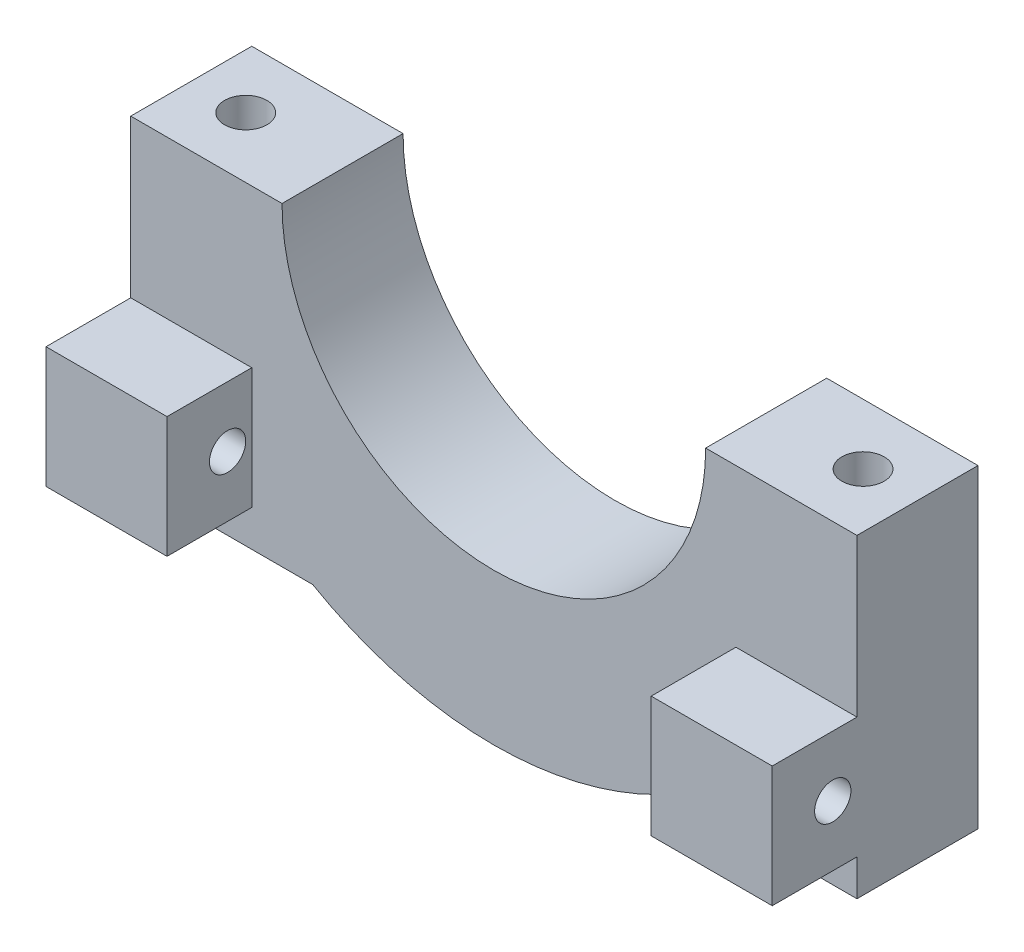
ISO-10303-21;
HEADER;
FILE_DESCRIPTION(('STEP AP214'),'2;1');
FILE_NAME('part.step','',(''),(''),'','','');
FILE_SCHEMA(('AUTOMOTIVE_DESIGN { 1 0 10303 214 1 1 1 1 }'));
ENDSEC;
DATA;
#1=APPLICATION_CONTEXT('core data for automotive mechanical design processes');
#2=APPLICATION_PROTOCOL_DEFINITION('international standard','automotive_design',2000,#1);
#3=PRODUCT_CONTEXT('',#1,'mechanical');
#4=PRODUCT('Part','Part','',(#3));
#5=PRODUCT_RELATED_PRODUCT_CATEGORY('part','',(#4));
#6=PRODUCT_DEFINITION_FORMATION('','',#4);
#7=PRODUCT_DEFINITION_CONTEXT('part definition',#1,'design');
#8=PRODUCT_DEFINITION('design','',#6,#7);
#9=PRODUCT_DEFINITION_SHAPE('','',#8);
#10=(LENGTH_UNIT() NAMED_UNIT(*) SI_UNIT(.MILLI.,.METRE.));
#11=(NAMED_UNIT(*) PLANE_ANGLE_UNIT() SI_UNIT($,.RADIAN.));
#12=(NAMED_UNIT(*) SI_UNIT($,.STERADIAN.) SOLID_ANGLE_UNIT());
#13=UNCERTAINTY_MEASURE_WITH_UNIT(LENGTH_MEASURE(1.E-05),#10,'distance_accuracy_value','');
#14=(GEOMETRIC_REPRESENTATION_CONTEXT(3) GLOBAL_UNCERTAINTY_ASSIGNED_CONTEXT((#13)) GLOBAL_UNIT_ASSIGNED_CONTEXT((#10,
#11,#12)) REPRESENTATION_CONTEXT('',''));
#15=CARTESIAN_POINT('',(0.,0.,0.));
#16=DIRECTION('',(0.,0.,1.));
#17=DIRECTION('',(1.,0.,0.));
#18=AXIS2_PLACEMENT_3D('',#15,#16,#17);
#19=CARTESIAN_POINT('',(30.,-26.,10.));
#20=DIRECTION('',(-1.,0.,0.));
#21=DIRECTION('',(0.,0.,1.));
#22=AXIS2_PLACEMENT_3D('',#19,#20,#21);
#23=PLANE('',#22);
#24=DIRECTION('',(0.,1.,0.));
#25=VECTOR('',#24,1.);
#26=CARTESIAN_POINT('',(30.,-26.,0.));
#27=LINE('',#26,#25);
#28=CARTESIAN_POINT('',(30.,-26.,0.));
#29=VERTEX_POINT('',#28);
#30=CARTESIAN_POINT('',(30.,0.,0.));
#31=VERTEX_POINT('',#30);
#32=EDGE_CURVE('E285',#29,#31,#27,.T.);
#33=ORIENTED_EDGE('',*,*,#32,.T.);
#34=DIRECTION('',(0.,0.,-1.));
#35=VECTOR('',#34,1.);
#36=CARTESIAN_POINT('',(30.,0.,10.));
#37=LINE('',#36,#35);
#38=CARTESIAN_POINT('',(30.,0.,10.));
#39=VERTEX_POINT('',#38);
#40=EDGE_CURVE('E266',#39,#31,#37,.T.);
#41=ORIENTED_EDGE('',*,*,#40,.F.);
#42=DIRECTION('',(0.,1.,0.));
#43=VECTOR('',#42,1.);
#44=CARTESIAN_POINT('',(30.,-26.,10.));
#45=LINE('',#44,#43);
#46=CARTESIAN_POINT('',(30.,-13.,10.));
#47=VERTEX_POINT('',#46);
#48=EDGE_CURVE('E155',#47,#39,#45,.T.);
#49=ORIENTED_EDGE('',*,*,#48,.F.);
#50=DIRECTION('',(0.,0.,-1.));
#51=VECTOR('',#50,1.);
#52=CARTESIAN_POINT('',(30.,-13.,17.));
#53=LINE('',#52,#51);
#54=CARTESIAN_POINT('',(30.,-13.,17.));
#55=VERTEX_POINT('',#54);
#56=EDGE_CURVE('E148',#55,#47,#53,.T.);
#57=ORIENTED_EDGE('',*,*,#56,.F.);
#58=DIRECTION('',(0.,-1.,0.));
#59=VECTOR('',#58,1.);
#60=CARTESIAN_POINT('',(30.,-13.,17.));
#61=LINE('',#60,#59);
#62=CARTESIAN_POINT('',(30.,-23.,17.));
#63=VERTEX_POINT('',#62);
#64=EDGE_CURVE('E152',#55,#63,#61,.T.);
#65=ORIENTED_EDGE('',*,*,#64,.T.);
#66=DIRECTION('',(0.,0.,-1.));
#67=VECTOR('',#66,1.);
#68=CARTESIAN_POINT('',(30.,-23.,17.));
#69=LINE('',#68,#67);
#70=CARTESIAN_POINT('',(30.,-23.,10.));
#71=VERTEX_POINT('',#70);
#72=EDGE_CURVE('E178',#63,#71,#69,.T.);
#73=ORIENTED_EDGE('',*,*,#72,.T.);
#74=CARTESIAN_POINT('',(30.,-26.,10.));
#75=VERTEX_POINT('',#74);
#76=EDGE_CURVE('E300',#75,#71,#45,.T.);
#77=ORIENTED_EDGE('',*,*,#76,.F.);
#78=DIRECTION('',(0.,0.,-1.));
#79=VECTOR('',#78,1.);
#80=CARTESIAN_POINT('',(30.,-26.,10.));
#81=LINE('',#80,#79);
#82=EDGE_CURVE('E263',#75,#29,#81,.T.);
#83=ORIENTED_EDGE('',*,*,#82,.T.);
#84=EDGE_LOOP('',(#33,#41,#49,#57,#65,#73,#77,#83));
#85=FACE_BOUND('',#84,.T.);
#86=CARTESIAN_POINT('',(30.,-18.,12.));
#87=DIRECTION('',(-1.,0.,0.));
#88=DIRECTION('',(0.,0.,1.));
#89=AXIS2_PLACEMENT_3D('',#86,#87,#88);
#90=CIRCLE('',#89,1.5);
#91=CARTESIAN_POINT('',(30.,-18.,10.5));
#92=VERTEX_POINT('',#91);
#93=EDGE_CURVE('E561',#92,#92,#90,.T.);
#94=ORIENTED_EDGE('',*,*,#93,.T.);
#95=EDGE_LOOP('',(#94));
#96=FACE_BOUND('',#95,.T.);
#97=ADVANCED_FACE('F33',(#85,#96),#23,.F.);
#98=CARTESIAN_POINT('',(20.,-13.,17.));
#99=DIRECTION('',(-1.,0.,0.));
#100=DIRECTION('',(0.,0.,1.));
#101=AXIS2_PLACEMENT_3D('',#98,#99,#100);
#102=PLANE('',#101);
#103=DIRECTION('',(0.,1.,0.));
#104=VECTOR('',#103,1.);
#105=CARTESIAN_POINT('',(20.,-13.,10.));
#106=LINE('',#105,#104);
#107=CARTESIAN_POINT('',(20.,-23.,10.));
#108=VERTEX_POINT('',#107);
#109=CARTESIAN_POINT('',(20.,-13.,10.));
#110=VERTEX_POINT('',#109);
#111=EDGE_CURVE('E50',#108,#110,#106,.T.);
#112=ORIENTED_EDGE('',*,*,#111,.F.);
#113=DIRECTION('',(0.,0.,-1.));
#114=VECTOR('',#113,1.);
#115=CARTESIAN_POINT('',(20.,-23.,17.));
#116=LINE('',#115,#114);
#117=CARTESIAN_POINT('',(20.,-23.,17.));
#118=VERTEX_POINT('',#117);
#119=EDGE_CURVE('E185',#118,#108,#116,.T.);
#120=ORIENTED_EDGE('',*,*,#119,.F.);
#121=DIRECTION('',(0.,1.,0.));
#122=VECTOR('',#121,1.);
#123=CARTESIAN_POINT('',(20.,-13.,17.));
#124=LINE('',#123,#122);
#125=CARTESIAN_POINT('',(20.,-13.,17.));
#126=VERTEX_POINT('',#125);
#127=EDGE_CURVE('E172',#118,#126,#124,.T.);
#128=ORIENTED_EDGE('',*,*,#127,.T.);
#129=DIRECTION('',(0.,0.,-1.));
#130=VECTOR('',#129,1.);
#131=CARTESIAN_POINT('',(20.,-13.,17.));
#132=LINE('',#131,#130);
#133=EDGE_CURVE('E160',#126,#110,#132,.T.);
#134=ORIENTED_EDGE('',*,*,#133,.T.);
#135=EDGE_LOOP('',(#112,#120,#128,#134));
#136=FACE_BOUND('',#135,.T.);
#137=CARTESIAN_POINT('',(20.,-18.,12.));
#138=DIRECTION('',(-1.,0.,0.));
#139=DIRECTION('',(0.,0.,1.));
#140=AXIS2_PLACEMENT_3D('',#137,#138,#139);
#141=CIRCLE('',#140,1.5);
#142=CARTESIAN_POINT('',(20.,-18.,10.5));
#143=VERTEX_POINT('',#142);
#144=EDGE_CURVE('E181',#143,#143,#141,.T.);
#145=ORIENTED_EDGE('',*,*,#144,.F.);
#146=EDGE_LOOP('',(#145));
#147=FACE_BOUND('',#146,.T.);
#148=ADVANCED_FACE('F326',(#136,#147),#102,.T.);
#149=CARTESIAN_POINT('',(-30.,-26.,10.));
#150=DIRECTION('',(0.,1.,0.));
#151=DIRECTION('',(0.,0.,1.));
#152=AXIS2_PLACEMENT_3D('',#149,#150,#151);
#153=PLANE('',#152);
#154=DIRECTION('',(1.,0.,0.));
#155=VECTOR('',#154,1.);
#156=CARTESIAN_POINT('',(-30.,-26.,0.));
#157=LINE('',#156,#155);
#158=CARTESIAN_POINT('',(-30.,-26.,0.));
#159=VERTEX_POINT('',#158);
#160=CARTESIAN_POINT('',(-14.9666295470958,-26.,0.));
#161=VERTEX_POINT('',#160);
#162=EDGE_CURVE('E291',#159,#161,#157,.T.);
#163=ORIENTED_EDGE('',*,*,#162,.T.);
#164=DIRECTION('',(0.,0.,-1.));
#165=VECTOR('',#164,1.);
#166=CARTESIAN_POINT('',(-14.9666295470958,-26.,10.));
#167=LINE('',#166,#165);
#168=CARTESIAN_POINT('',(-14.9666295470958,-26.,10.));
#169=VERTEX_POINT('',#168);
#170=EDGE_CURVE('E42',#169,#161,#167,.T.);
#171=ORIENTED_EDGE('',*,*,#170,.F.);
#172=DIRECTION('',(1.,0.,0.));
#173=VECTOR('',#172,1.);
#174=CARTESIAN_POINT('',(-30.,-26.,10.));
#175=LINE('',#174,#173);
#176=CARTESIAN_POINT('',(-30.,-26.,10.));
#177=VERTEX_POINT('',#176);
#178=EDGE_CURVE('E249',#177,#169,#175,.T.);
#179=ORIENTED_EDGE('',*,*,#178,.F.);
#180=DIRECTION('',(0.,0.,-1.));
#181=VECTOR('',#180,1.);
#182=CARTESIAN_POINT('',(-30.,-26.,10.));
#183=LINE('',#182,#181);
#184=EDGE_CURVE('E11',#177,#159,#183,.T.);
#185=ORIENTED_EDGE('',*,*,#184,.T.);
#186=EDGE_LOOP('',(#163,#171,#179,#185));
#187=FACE_BOUND('',#186,.T.);
#188=CARTESIAN_POINT('',(-25.5,-26.,5.));
#189=DIRECTION('',(0.,1.,0.));
#190=DIRECTION('',(0.,0.,1.));
#191=AXIS2_PLACEMENT_3D('',#188,#189,#190);
#192=CIRCLE('',#191,1.75);
#193=CARTESIAN_POINT('',(-25.5,-26.,6.75));
#194=VERTEX_POINT('',#193);
#195=EDGE_CURVE('E233',#194,#194,#192,.T.);
#196=ORIENTED_EDGE('',*,*,#195,.T.);
#197=EDGE_LOOP('',(#196));
#198=FACE_BOUND('',#197,.T.);
#199=ADVANCED_FACE('F312',(#187,#198),#153,.F.);
#200=CARTESIAN_POINT('',(-17.5,0.,10.));
#201=DIRECTION('',(0.,-1.,0.));
#202=DIRECTION('',(1.,0.,0.));
#203=AXIS2_PLACEMENT_3D('',#200,#201,#202);
#204=PLANE('',#203);
#205=DIRECTION('',(-1.,0.,0.));
#206=VECTOR('',#205,1.);
#207=CARTESIAN_POINT('',(-17.5,0.,0.));
#208=LINE('',#207,#206);
#209=CARTESIAN_POINT('',(-17.5,0.,0.));
#210=VERTEX_POINT('',#209);
#211=CARTESIAN_POINT('',(-30.,0.,0.));
#212=VERTEX_POINT('',#211);
#213=EDGE_CURVE('E279',#210,#212,#208,.T.);
#214=ORIENTED_EDGE('',*,*,#213,.T.);
#215=DIRECTION('',(0.,0.,-1.));
#216=VECTOR('',#215,1.);
#217=CARTESIAN_POINT('',(-30.,0.,10.));
#218=LINE('',#217,#216);
#219=CARTESIAN_POINT('',(-30.,0.,10.));
#220=VERTEX_POINT('',#219);
#221=EDGE_CURVE('E275',#220,#212,#218,.T.);
#222=ORIENTED_EDGE('',*,*,#221,.F.);
#223=DIRECTION('',(-1.,0.,0.));
#224=VECTOR('',#223,1.);
#225=CARTESIAN_POINT('',(-17.5,0.,10.));
#226=LINE('',#225,#224);
#227=CARTESIAN_POINT('',(-17.5,0.,10.));
#228=VERTEX_POINT('',#227);
#229=EDGE_CURVE('E278',#228,#220,#226,.T.);
#230=ORIENTED_EDGE('',*,*,#229,.F.);
#231=DIRECTION('',(0.,0.,-1.));
#232=VECTOR('',#231,1.);
#233=CARTESIAN_POINT('',(-17.5,0.,10.));
#234=LINE('',#233,#232);
#235=EDGE_CURVE('E272',#228,#210,#234,.T.);
#236=ORIENTED_EDGE('',*,*,#235,.T.);
#237=EDGE_LOOP('',(#214,#222,#230,#236));
#238=FACE_BOUND('',#237,.T.);
#239=CARTESIAN_POINT('',(-25.5,0.,5.));
#240=DIRECTION('',(0.,-1.,0.));
#241=DIRECTION('',(0.,0.,1.));
#242=AXIS2_PLACEMENT_3D('',#239,#240,#241);
#243=CIRCLE('',#242,1.75);
#244=CARTESIAN_POINT('',(-25.5,0.,6.75));
#245=VERTEX_POINT('',#244);
#246=EDGE_CURVE('E235',#245,#245,#243,.T.);
#247=ORIENTED_EDGE('',*,*,#246,.T.);
#248=EDGE_LOOP('',(#247));
#249=FACE_BOUND('',#248,.T.);
#250=ADVANCED_FACE('F342',(#238,#249),#204,.F.);
#251=CARTESIAN_POINT('',(-30.,-26.,10.));
#252=DIRECTION('',(1.,0.,0.));
#253=DIRECTION('',(0.,0.,-1.));
#254=AXIS2_PLACEMENT_3D('',#251,#252,#253);
#255=PLANE('',#254);
#256=CARTESIAN_POINT('',(-30.,-18.,12.));
#257=DIRECTION('',(-1.,0.,0.));
#258=DIRECTION('',(0.,0.,1.));
#259=AXIS2_PLACEMENT_3D('',#256,#257,#258);
#260=CIRCLE('',#259,1.5);
#261=CARTESIAN_POINT('',(-30.,-18.,13.5));
#262=VERTEX_POINT('',#261);
#263=EDGE_CURVE('E159',#262,#262,#260,.T.);
#264=ORIENTED_EDGE('',*,*,#263,.F.);
#265=EDGE_LOOP('',(#264));
#266=FACE_BOUND('',#265,.T.);
#267=DIRECTION('',(0.,-1.,0.));
#268=VECTOR('',#267,1.);
#269=CARTESIAN_POINT('',(-30.,-26.,0.));
#270=LINE('',#269,#268);
#271=EDGE_CURVE('E246',#212,#159,#270,.T.);
#272=ORIENTED_EDGE('',*,*,#271,.T.);
#273=ORIENTED_EDGE('',*,*,#184,.F.);
#274=DIRECTION('',(0.,-1.,0.));
#275=VECTOR('',#274,1.);
#276=CARTESIAN_POINT('',(-30.,-26.,10.));
#277=LINE('',#276,#275);
#278=CARTESIAN_POINT('',(-30.,-23.,10.));
#279=VERTEX_POINT('',#278);
#280=EDGE_CURVE('E253',#279,#177,#277,.T.);
#281=ORIENTED_EDGE('',*,*,#280,.F.);
#282=DIRECTION('',(0.,0.,-1.));
#283=VECTOR('',#282,1.);
#284=CARTESIAN_POINT('',(-30.,-23.,17.));
#285=LINE('',#284,#283);
#286=CARTESIAN_POINT('',(-30.,-23.,17.));
#287=VERTEX_POINT('',#286);
#288=EDGE_CURVE('E228',#287,#279,#285,.T.);
#289=ORIENTED_EDGE('',*,*,#288,.F.);
#290=DIRECTION('',(0.,-1.,0.));
#291=VECTOR('',#290,1.);
#292=CARTESIAN_POINT('',(-30.,-13.,17.));
#293=LINE('',#292,#291);
#294=CARTESIAN_POINT('',(-30.,-13.,17.));
#295=VERTEX_POINT('',#294);
#296=EDGE_CURVE('E194',#295,#287,#293,.T.);
#297=ORIENTED_EDGE('',*,*,#296,.F.);
#298=DIRECTION('',(0.,0.,-1.));
#299=VECTOR('',#298,1.);
#300=CARTESIAN_POINT('',(-30.,-13.,17.));
#301=LINE('',#300,#299);
#302=CARTESIAN_POINT('',(-30.,-13.,10.));
#303=VERTEX_POINT('',#302);
#304=EDGE_CURVE('E204',#295,#303,#301,.T.);
#305=ORIENTED_EDGE('',*,*,#304,.T.);
#306=EDGE_CURVE('E256',#220,#303,#277,.T.);
#307=ORIENTED_EDGE('',*,*,#306,.F.);
#308=ORIENTED_EDGE('',*,*,#221,.T.);
#309=EDGE_LOOP('',(#272,#273,#281,#289,#297,#305,#307,#308));
#310=FACE_BOUND('',#309,.T.);
#311=ADVANCED_FACE('F35',(#266,#310),#255,.F.);
#312=CARTESIAN_POINT('',(0.,0.,10.));
#313=DIRECTION('',(0.,0.,-1.));
#314=DIRECTION('',(-1.,0.,0.));
#315=AXIS2_PLACEMENT_3D('',#312,#313,#314);
#316=CYLINDRICAL_SURFACE('',#315,30.);
#317=CARTESIAN_POINT('',(0.,0.,0.));
#318=DIRECTION('',(0.,0.,1.));
#319=DIRECTION('',(1.,0.,0.));
#320=AXIS2_PLACEMENT_3D('',#317,#318,#319);
#321=CIRCLE('',#320,30.);
#322=CARTESIAN_POINT('',(14.9666295470958,-26.,0.));
#323=VERTEX_POINT('',#322);
#324=EDGE_CURVE('E289',#161,#323,#321,.T.);
#325=ORIENTED_EDGE('',*,*,#324,.T.);
#326=DIRECTION('',(0.,0.,-1.));
#327=VECTOR('',#326,1.);
#328=CARTESIAN_POINT('',(14.9666295470958,-26.,10.));
#329=LINE('',#328,#327);
#330=CARTESIAN_POINT('',(14.9666295470958,-26.,10.));
#331=VERTEX_POINT('',#330);
#332=EDGE_CURVE('E260',#331,#323,#329,.T.);
#333=ORIENTED_EDGE('',*,*,#332,.F.);
#334=CARTESIAN_POINT('',(0.,0.,10.));
#335=DIRECTION('',(0.,0.,1.));
#336=DIRECTION('',(1.,0.,0.));
#337=AXIS2_PLACEMENT_3D('',#334,#335,#336);
#338=CIRCLE('',#337,30.);
#339=EDGE_CURVE('E303',#169,#331,#338,.T.);
#340=ORIENTED_EDGE('',*,*,#339,.F.);
#341=ORIENTED_EDGE('',*,*,#170,.T.);
#342=EDGE_LOOP('',(#325,#333,#340,#341));
#343=FACE_BOUND('',#342,.T.);
#344=ADVANCED_FACE('F316',(#343),#316,.T.);
#345=CARTESIAN_POINT('',(14.9666295470958,-26.,10.));
#346=DIRECTION('',(0.,1.,0.));
#347=DIRECTION('',(0.,0.,1.));
#348=AXIS2_PLACEMENT_3D('',#345,#346,#347);
#349=PLANE('',#348);
#350=CARTESIAN_POINT('',(25.5,-26.,5.));
#351=DIRECTION('',(0.,1.,0.));
#352=DIRECTION('',(0.,0.,1.));
#353=AXIS2_PLACEMENT_3D('',#350,#351,#352);
#354=CIRCLE('',#353,1.75);
#355=CARTESIAN_POINT('',(25.5,-26.,6.75));
#356=VERTEX_POINT('',#355);
#357=EDGE_CURVE('E243',#356,#356,#354,.F.);
#358=ORIENTED_EDGE('',*,*,#357,.F.);
#359=EDGE_LOOP('',(#358));
#360=FACE_BOUND('',#359,.T.);
#361=DIRECTION('',(1.,0.,0.));
#362=VECTOR('',#361,1.);
#363=CARTESIAN_POINT('',(14.9666295470958,-26.,0.));
#364=LINE('',#363,#362);
#365=EDGE_CURVE('E287',#323,#29,#364,.T.);
#366=ORIENTED_EDGE('',*,*,#365,.T.);
#367=ORIENTED_EDGE('',*,*,#82,.F.);
#368=DIRECTION('',(1.,0.,0.));
#369=VECTOR('',#368,1.);
#370=CARTESIAN_POINT('',(14.9666295470958,-26.,10.));
#371=LINE('',#370,#369);
#372=EDGE_CURVE('E302',#331,#75,#371,.T.);
#373=ORIENTED_EDGE('',*,*,#372,.F.);
#374=ORIENTED_EDGE('',*,*,#332,.T.);
#375=EDGE_LOOP('',(#366,#367,#373,#374));
#376=FACE_BOUND('',#375,.T.);
#377=ADVANCED_FACE('F321',(#360,#376),#349,.F.);
#378=CARTESIAN_POINT('',(30.,0.,10.));
#379=DIRECTION('',(0.,-1.,0.));
#380=DIRECTION('',(1.,0.,0.));
#381=AXIS2_PLACEMENT_3D('',#378,#379,#380);
#382=PLANE('',#381);
#383=CARTESIAN_POINT('',(25.5,0.,5.));
#384=DIRECTION('',(0.,1.,0.));
#385=DIRECTION('',(0.,0.,1.));
#386=AXIS2_PLACEMENT_3D('',#383,#384,#385);
#387=CIRCLE('',#386,1.75);
#388=CARTESIAN_POINT('',(25.5,0.,6.75));
#389=VERTEX_POINT('',#388);
#390=EDGE_CURVE('E238',#389,#389,#387,.T.);
#391=ORIENTED_EDGE('',*,*,#390,.F.);
#392=EDGE_LOOP('',(#391));
#393=FACE_BOUND('',#392,.T.);
#394=DIRECTION('',(-1.,0.,0.));
#395=VECTOR('',#394,1.);
#396=CARTESIAN_POINT('',(30.,0.,0.));
#397=LINE('',#396,#395);
#398=CARTESIAN_POINT('',(17.5,0.,0.));
#399=VERTEX_POINT('',#398);
#400=EDGE_CURVE('E283',#31,#399,#397,.T.);
#401=ORIENTED_EDGE('',*,*,#400,.T.);
#402=DIRECTION('',(0.,0.,-1.));
#403=VECTOR('',#402,1.);
#404=CARTESIAN_POINT('',(17.5,0.,10.));
#405=LINE('',#404,#403);
#406=CARTESIAN_POINT('',(17.5,0.,10.));
#407=VERTEX_POINT('',#406);
#408=EDGE_CURVE('E269',#407,#399,#405,.T.);
#409=ORIENTED_EDGE('',*,*,#408,.F.);
#410=DIRECTION('',(-1.,0.,0.));
#411=VECTOR('',#410,1.);
#412=CARTESIAN_POINT('',(30.,0.,10.));
#413=LINE('',#412,#411);
#414=EDGE_CURVE('E298',#39,#407,#413,.T.);
#415=ORIENTED_EDGE('',*,*,#414,.F.);
#416=ORIENTED_EDGE('',*,*,#40,.T.);
#417=EDGE_LOOP('',(#401,#409,#415,#416));
#418=FACE_BOUND('',#417,.T.);
#419=ADVANCED_FACE('F333',(#393,#418),#382,.F.);
#420=CARTESIAN_POINT('',(0.,0.,10.));
#421=DIRECTION('',(0.,0.,-1.));
#422=DIRECTION('',(-1.,0.,0.));
#423=AXIS2_PLACEMENT_3D('',#420,#421,#422);
#424=CYLINDRICAL_SURFACE('',#423,17.5);
#425=CARTESIAN_POINT('',(0.,0.,0.));
#426=DIRECTION('',(0.,0.,-1.));
#427=DIRECTION('',(1.,0.,0.));
#428=AXIS2_PLACEMENT_3D('',#425,#426,#427);
#429=CIRCLE('',#428,17.5);
#430=EDGE_CURVE('E281',#399,#210,#429,.T.);
#431=ORIENTED_EDGE('',*,*,#430,.T.);
#432=ORIENTED_EDGE('',*,*,#235,.F.);
#433=CARTESIAN_POINT('',(0.,0.,10.));
#434=DIRECTION('',(0.,0.,-1.));
#435=DIRECTION('',(1.,0.,0.));
#436=AXIS2_PLACEMENT_3D('',#433,#434,#435);
#437=CIRCLE('',#436,17.5);
#438=EDGE_CURVE('E296',#407,#228,#437,.T.);
#439=ORIENTED_EDGE('',*,*,#438,.F.);
#440=ORIENTED_EDGE('',*,*,#408,.T.);
#441=EDGE_LOOP('',(#431,#432,#439,#440));
#442=FACE_BOUND('',#441,.T.);
#443=ADVANCED_FACE('F338',(#442),#424,.F.);
#444=CARTESIAN_POINT('',(0.,0.,10.));
#445=DIRECTION('',(0.,0.,1.));
#446=DIRECTION('',(1.,0.,0.));
#447=AXIS2_PLACEMENT_3D('',#444,#445,#446);
#448=PLANE('',#447);
#449=DIRECTION('',(1.,0.,0.));
#450=VECTOR('',#449,1.);
#451=CARTESIAN_POINT('',(30.,-13.,10.));
#452=LINE('',#451,#450);
#453=EDGE_CURVE('E179',#110,#47,#452,.T.);
#454=ORIENTED_EDGE('',*,*,#453,.T.);
#455=ORIENTED_EDGE('',*,*,#48,.T.);
#456=ORIENTED_EDGE('',*,*,#414,.T.);
#457=ORIENTED_EDGE('',*,*,#438,.T.);
#458=ORIENTED_EDGE('',*,*,#229,.T.);
#459=ORIENTED_EDGE('',*,*,#306,.T.);
#460=DIRECTION('',(-1.,0.,0.));
#461=VECTOR('',#460,1.);
#462=CARTESIAN_POINT('',(-30.,-13.,10.));
#463=LINE('',#462,#461);
#464=CARTESIAN_POINT('',(-20.,-13.,10.));
#465=VERTEX_POINT('',#464);
#466=EDGE_CURVE('E198',#465,#303,#463,.T.);
#467=ORIENTED_EDGE('',*,*,#466,.F.);
#468=DIRECTION('',(0.,1.,0.));
#469=VECTOR('',#468,1.);
#470=CARTESIAN_POINT('',(-20.,-13.,10.));
#471=LINE('',#470,#469);
#472=CARTESIAN_POINT('',(-20.,-23.,10.));
#473=VERTEX_POINT('',#472);
#474=EDGE_CURVE('E205',#473,#465,#471,.T.);
#475=ORIENTED_EDGE('',*,*,#474,.F.);
#476=DIRECTION('',(1.,0.,0.));
#477=VECTOR('',#476,1.);
#478=CARTESIAN_POINT('',(-30.,-23.,10.));
#479=LINE('',#478,#477);
#480=EDGE_CURVE('E193',#279,#473,#479,.T.);
#481=ORIENTED_EDGE('',*,*,#480,.F.);
#482=ORIENTED_EDGE('',*,*,#280,.T.);
#483=ORIENTED_EDGE('',*,*,#178,.T.);
#484=ORIENTED_EDGE('',*,*,#339,.T.);
#485=ORIENTED_EDGE('',*,*,#372,.T.);
#486=ORIENTED_EDGE('',*,*,#76,.T.);
#487=DIRECTION('',(-1.,0.,0.));
#488=VECTOR('',#487,1.);
#489=CARTESIAN_POINT('',(30.,-23.,10.));
#490=LINE('',#489,#488);
#491=EDGE_CURVE('E55',#71,#108,#490,.T.);
#492=ORIENTED_EDGE('',*,*,#491,.T.);
#493=ORIENTED_EDGE('',*,*,#111,.T.);
#494=EDGE_LOOP('',(#454,#455,#456,#457,#458,#459,#467,#475,#481,#482,#483,#484,#485,#486,#492,#493));
#495=FACE_BOUND('',#494,.T.);
#496=ADVANCED_FACE('F308',(#495),#448,.T.);
#497=CARTESIAN_POINT('',(0.,0.,0.));
#498=DIRECTION('',(0.,0.,1.));
#499=DIRECTION('',(1.,0.,0.));
#500=AXIS2_PLACEMENT_3D('',#497,#498,#499);
#501=PLANE('',#500);
#502=ORIENTED_EDGE('',*,*,#271,.F.);
#503=ORIENTED_EDGE('',*,*,#213,.F.);
#504=ORIENTED_EDGE('',*,*,#430,.F.);
#505=ORIENTED_EDGE('',*,*,#400,.F.);
#506=ORIENTED_EDGE('',*,*,#32,.F.);
#507=ORIENTED_EDGE('',*,*,#365,.F.);
#508=ORIENTED_EDGE('',*,*,#324,.F.);
#509=ORIENTED_EDGE('',*,*,#162,.F.);
#510=EDGE_LOOP('',(#502,#503,#504,#505,#506,#507,#508,#509));
#511=FACE_BOUND('',#510,.T.);
#512=ADVANCED_FACE('F465',(#511),#501,.F.);
#513=CARTESIAN_POINT('',(25.5,-30.001,5.));
#514=DIRECTION('',(0.,1.,0.));
#515=DIRECTION('',(0.,0.,1.));
#516=AXIS2_PLACEMENT_3D('',#513,#514,#515);
#517=CYLINDRICAL_SURFACE('',#516,1.75);
#518=ORIENTED_EDGE('',*,*,#390,.T.);
#519=EDGE_LOOP('',(#518));
#520=FACE_BOUND('',#519,.T.);
#521=ORIENTED_EDGE('',*,*,#357,.T.);
#522=EDGE_LOOP('',(#521));
#523=FACE_BOUND('',#522,.T.);
#524=ADVANCED_FACE('F388',(#520,#523),#517,.F.);
#525=CARTESIAN_POINT('',(-25.5,-30.001,5.));
#526=DIRECTION('',(0.,1.,0.));
#527=DIRECTION('',(0.,0.,1.));
#528=AXIS2_PLACEMENT_3D('',#525,#526,#527);
#529=CYLINDRICAL_SURFACE('',#528,1.75);
#530=ORIENTED_EDGE('',*,*,#246,.F.);
#531=EDGE_LOOP('',(#530));
#532=FACE_BOUND('',#531,.T.);
#533=ORIENTED_EDGE('',*,*,#195,.F.);
#534=EDGE_LOOP('',(#533));
#535=FACE_BOUND('',#534,.T.);
#536=ADVANCED_FACE('F382',(#532,#535),#529,.F.);
#537=CARTESIAN_POINT('',(-30.,-23.,17.));
#538=DIRECTION('',(0.,1.,0.));
#539=DIRECTION('',(-1.,0.,0.));
#540=AXIS2_PLACEMENT_3D('',#537,#538,#539);
#541=PLANE('',#540);
#542=ORIENTED_EDGE('',*,*,#480,.T.);
#543=DIRECTION('',(0.,0.,-1.));
#544=VECTOR('',#543,1.);
#545=CARTESIAN_POINT('',(-20.,-23.,17.));
#546=LINE('',#545,#544);
#547=CARTESIAN_POINT('',(-20.,-23.,17.));
#548=VERTEX_POINT('',#547);
#549=EDGE_CURVE('E223',#548,#473,#546,.T.);
#550=ORIENTED_EDGE('',*,*,#549,.F.);
#551=DIRECTION('',(1.,0.,0.));
#552=VECTOR('',#551,1.);
#553=CARTESIAN_POINT('',(-30.,-23.,17.));
#554=LINE('',#553,#552);
#555=EDGE_CURVE('E197',#287,#548,#554,.T.);
#556=ORIENTED_EDGE('',*,*,#555,.F.);
#557=ORIENTED_EDGE('',*,*,#288,.T.);
#558=EDGE_LOOP('',(#542,#550,#556,#557));
#559=FACE_BOUND('',#558,.T.);
#560=ADVANCED_FACE('F387',(#559),#541,.F.);
#561=CARTESIAN_POINT('',(-20.,-13.,17.));
#562=DIRECTION('',(-1.,0.,0.));
#563=DIRECTION('',(0.,0.,1.));
#564=AXIS2_PLACEMENT_3D('',#561,#562,#563);
#565=PLANE('',#564);
#566=CARTESIAN_POINT('',(-20.,-18.,12.));
#567=DIRECTION('',(-1.,0.,0.));
#568=DIRECTION('',(0.,0.,1.));
#569=AXIS2_PLACEMENT_3D('',#566,#567,#568);
#570=CIRCLE('',#569,1.5);
#571=CARTESIAN_POINT('',(-20.,-18.,13.5));
#572=VERTEX_POINT('',#571);
#573=EDGE_CURVE('E190',#572,#572,#570,.F.);
#574=ORIENTED_EDGE('',*,*,#573,.F.);
#575=EDGE_LOOP('',(#574));
#576=FACE_BOUND('',#575,.T.);
#577=ORIENTED_EDGE('',*,*,#474,.T.);
#578=DIRECTION('',(0.,0.,-1.));
#579=VECTOR('',#578,1.);
#580=CARTESIAN_POINT('',(-20.,-13.,17.));
#581=LINE('',#580,#579);
#582=CARTESIAN_POINT('',(-20.,-13.,17.));
#583=VERTEX_POINT('',#582);
#584=EDGE_CURVE('E210',#583,#465,#581,.T.);
#585=ORIENTED_EDGE('',*,*,#584,.F.);
#586=DIRECTION('',(0.,1.,0.));
#587=VECTOR('',#586,1.);
#588=CARTESIAN_POINT('',(-20.,-13.,17.));
#589=LINE('',#588,#587);
#590=EDGE_CURVE('E200',#548,#583,#589,.T.);
#591=ORIENTED_EDGE('',*,*,#590,.F.);
#592=ORIENTED_EDGE('',*,*,#549,.T.);
#593=EDGE_LOOP('',(#577,#585,#591,#592));
#594=FACE_BOUND('',#593,.T.);
#595=ADVANCED_FACE('F400',(#576,#594),#565,.F.);
#596=CARTESIAN_POINT('',(-30.,-13.,17.));
#597=DIRECTION('',(0.,-1.,0.));
#598=DIRECTION('',(0.,0.,-1.));
#599=AXIS2_PLACEMENT_3D('',#596,#597,#598);
#600=PLANE('',#599);
#601=ORIENTED_EDGE('',*,*,#466,.T.);
#602=ORIENTED_EDGE('',*,*,#304,.F.);
#603=DIRECTION('',(-1.,0.,0.));
#604=VECTOR('',#603,1.);
#605=CARTESIAN_POINT('',(-30.,-13.,17.));
#606=LINE('',#605,#604);
#607=EDGE_CURVE('E202',#583,#295,#606,.T.);
#608=ORIENTED_EDGE('',*,*,#607,.F.);
#609=ORIENTED_EDGE('',*,*,#584,.T.);
#610=EDGE_LOOP('',(#601,#602,#608,#609));
#611=FACE_BOUND('',#610,.T.);
#612=ADVANCED_FACE('F408',(#611),#600,.F.);
#613=CARTESIAN_POINT('',(-30.,-23.,17.));
#614=DIRECTION('',(0.,0.,1.));
#615=DIRECTION('',(1.,0.,0.));
#616=AXIS2_PLACEMENT_3D('',#613,#614,#615);
#617=PLANE('',#616);
#618=ORIENTED_EDGE('',*,*,#296,.T.);
#619=ORIENTED_EDGE('',*,*,#555,.T.);
#620=ORIENTED_EDGE('',*,*,#590,.T.);
#621=ORIENTED_EDGE('',*,*,#607,.T.);
#622=EDGE_LOOP('',(#618,#619,#620,#621));
#623=FACE_BOUND('',#622,.T.);
#624=ADVANCED_FACE('F413',(#623),#617,.T.);
#625=CARTESIAN_POINT('',(30.001,-18.,12.));
#626=DIRECTION('',(-1.,0.,0.));
#627=DIRECTION('',(0.,0.,1.));
#628=AXIS2_PLACEMENT_3D('',#625,#626,#627);
#629=CYLINDRICAL_SURFACE('',#628,1.5);
#630=ORIENTED_EDGE('',*,*,#263,.T.);
#631=EDGE_LOOP('',(#630));
#632=FACE_BOUND('',#631,.T.);
#633=ORIENTED_EDGE('',*,*,#573,.T.);
#634=EDGE_LOOP('',(#633));
#635=FACE_BOUND('',#634,.T.);
#636=ADVANCED_FACE('F421',(#632,#635),#629,.F.);
#637=CARTESIAN_POINT('',(30.,-13.,17.));
#638=DIRECTION('',(0.,1.,0.));
#639=DIRECTION('',(0.,0.,1.));
#640=AXIS2_PLACEMENT_3D('',#637,#638,#639);
#641=PLANE('',#640);
#642=ORIENTED_EDGE('',*,*,#453,.F.);
#643=ORIENTED_EDGE('',*,*,#133,.F.);
#644=DIRECTION('',(1.,0.,0.));
#645=VECTOR('',#644,1.);
#646=CARTESIAN_POINT('',(30.,-13.,17.));
#647=LINE('',#646,#645);
#648=EDGE_CURVE('E166',#126,#55,#647,.T.);
#649=ORIENTED_EDGE('',*,*,#648,.T.);
#650=ORIENTED_EDGE('',*,*,#56,.T.);
#651=EDGE_LOOP('',(#642,#643,#649,#650));
#652=FACE_BOUND('',#651,.T.);
#653=ADVANCED_FACE('F171',(#652),#641,.T.);
#654=CARTESIAN_POINT('',(30.,-23.,17.));
#655=DIRECTION('',(0.,-1.,0.));
#656=DIRECTION('',(1.,0.,0.));
#657=AXIS2_PLACEMENT_3D('',#654,#655,#656);
#658=PLANE('',#657);
#659=ORIENTED_EDGE('',*,*,#491,.F.);
#660=ORIENTED_EDGE('',*,*,#72,.F.);
#661=DIRECTION('',(-1.,0.,0.));
#662=VECTOR('',#661,1.);
#663=CARTESIAN_POINT('',(30.,-23.,17.));
#664=LINE('',#663,#662);
#665=EDGE_CURVE('E169',#63,#118,#664,.T.);
#666=ORIENTED_EDGE('',*,*,#665,.T.);
#667=ORIENTED_EDGE('',*,*,#119,.T.);
#668=EDGE_LOOP('',(#659,#660,#666,#667));
#669=FACE_BOUND('',#668,.T.);
#670=ADVANCED_FACE('F324',(#669),#658,.T.);
#671=CARTESIAN_POINT('',(30.,-23.,17.));
#672=DIRECTION('',(0.,0.,1.));
#673=DIRECTION('',(-1.,0.,0.));
#674=AXIS2_PLACEMENT_3D('',#671,#672,#673);
#675=PLANE('',#674);
#676=ORIENTED_EDGE('',*,*,#64,.F.);
#677=ORIENTED_EDGE('',*,*,#648,.F.);
#678=ORIENTED_EDGE('',*,*,#127,.F.);
#679=ORIENTED_EDGE('',*,*,#665,.F.);
#680=EDGE_LOOP('',(#676,#677,#678,#679));
#681=FACE_BOUND('',#680,.T.);
#682=ADVANCED_FACE('F164',(#681),#675,.T.);
#683=CARTESIAN_POINT('',(-30.00105,-18.,12.));
#684=DIRECTION('',(1.,0.,0.));
#685=DIRECTION('',(0.,0.,-1.));
#686=AXIS2_PLACEMENT_3D('',#683,#684,#685);
#687=CYLINDRICAL_SURFACE('',#686,1.5);
#688=CARTESIAN_POINT('',(20.,-18.,10.5));
#689=CARTESIAN_POINT('',(20.1041666666667,-18.,10.5));
#690=CARTESIAN_POINT('',(20.2083333333333,-18.,10.5));
#691=CARTESIAN_POINT('',(20.4166666666667,-18.,10.5));
#692=CARTESIAN_POINT('',(20.5208333333333,-18.,10.5));
#693=CARTESIAN_POINT('',(20.7291666666667,-18.,10.5));
#694=CARTESIAN_POINT('',(20.8333333333333,-18.,10.5));
#695=CARTESIAN_POINT('',(21.0416666666667,-18.,10.5));
#696=CARTESIAN_POINT('',(21.1458333333333,-18.,10.5));
#697=CARTESIAN_POINT('',(21.3541666666667,-18.,10.5));
#698=CARTESIAN_POINT('',(21.4583333333333,-18.,10.5));
#699=CARTESIAN_POINT('',(21.6666666666667,-18.,10.5));
#700=CARTESIAN_POINT('',(21.7708333333333,-18.,10.5));
#701=CARTESIAN_POINT('',(21.9791666666667,-18.,10.5));
#702=CARTESIAN_POINT('',(22.0833333333333,-18.,10.5));
#703=CARTESIAN_POINT('',(22.2916666666667,-18.,10.5));
#704=CARTESIAN_POINT('',(22.3958333333333,-18.,10.5));
#705=CARTESIAN_POINT('',(22.6041666666667,-18.,10.5));
#706=CARTESIAN_POINT('',(22.7083333333333,-18.,10.5));
#707=CARTESIAN_POINT('',(22.9166666666667,-18.,10.5));
#708=CARTESIAN_POINT('',(23.0208333333333,-18.,10.5));
#709=CARTESIAN_POINT('',(23.2291666666667,-18.,10.5));
#710=CARTESIAN_POINT('',(23.3333333333333,-18.,10.5));
#711=CARTESIAN_POINT('',(23.5416666666667,-18.,10.5));
#712=CARTESIAN_POINT('',(23.6458333333333,-18.,10.5));
#713=CARTESIAN_POINT('',(23.8541666666667,-18.,10.5));
#714=CARTESIAN_POINT('',(23.9583333333333,-18.,10.5));
#715=CARTESIAN_POINT('',(24.1666666666667,-18.,10.5));
#716=CARTESIAN_POINT('',(24.2708333333333,-18.,10.5));
#717=CARTESIAN_POINT('',(24.4791666666667,-18.,10.5));
#718=CARTESIAN_POINT('',(24.5833333333333,-18.,10.5));
#719=CARTESIAN_POINT('',(24.7916666666667,-18.,10.5));
#720=CARTESIAN_POINT('',(24.8958333333333,-18.,10.5));
#721=CARTESIAN_POINT('',(25.1041666666667,-18.,10.5));
#722=CARTESIAN_POINT('',(25.2083333333333,-18.,10.5));
#723=CARTESIAN_POINT('',(25.4166666666667,-18.,10.5));
#724=CARTESIAN_POINT('',(25.5208333333333,-18.,10.5));
#725=CARTESIAN_POINT('',(25.7291666666667,-18.,10.5));
#726=CARTESIAN_POINT('',(25.8333333333333,-18.,10.5));
#727=CARTESIAN_POINT('',(26.0416666666667,-18.,10.5));
#728=CARTESIAN_POINT('',(26.1458333333333,-18.,10.5));
#729=CARTESIAN_POINT('',(26.3541666666667,-18.,10.5));
#730=CARTESIAN_POINT('',(26.4583333333333,-18.,10.5));
#731=CARTESIAN_POINT('',(26.6666666666667,-18.,10.5));
#732=CARTESIAN_POINT('',(26.7708333333333,-18.,10.5));
#733=CARTESIAN_POINT('',(26.9791666666667,-18.,10.5));
#734=CARTESIAN_POINT('',(27.0833333333333,-18.,10.5));
#735=CARTESIAN_POINT('',(27.2916666666667,-18.,10.5));
#736=CARTESIAN_POINT('',(27.3958333333333,-18.,10.5));
#737=CARTESIAN_POINT('',(27.6041666666667,-18.,10.5));
#738=CARTESIAN_POINT('',(27.7083333333333,-18.,10.5));
#739=CARTESIAN_POINT('',(27.9166666666667,-18.,10.5));
#740=CARTESIAN_POINT('',(28.0208333333333,-18.,10.5));
#741=CARTESIAN_POINT('',(28.2291666666667,-18.,10.5));
#742=CARTESIAN_POINT('',(28.3333333333333,-18.,10.5));
#743=CARTESIAN_POINT('',(28.5416666666667,-18.,10.5));
#744=CARTESIAN_POINT('',(28.6458333333333,-18.,10.5));
#745=CARTESIAN_POINT('',(28.8541666666667,-18.,10.5));
#746=CARTESIAN_POINT('',(28.9583333333333,-18.,10.5));
#747=CARTESIAN_POINT('',(29.1666666666667,-18.,10.5));
#748=CARTESIAN_POINT('',(29.2708333333333,-18.,10.5));
#749=CARTESIAN_POINT('',(29.4791666666667,-18.,10.5));
#750=CARTESIAN_POINT('',(29.5833333333333,-18.,10.5));
#751=CARTESIAN_POINT('',(29.7916666666667,-18.,10.5));
#752=CARTESIAN_POINT('',(29.8958333333333,-18.,10.5));
#753=CARTESIAN_POINT('',(30.,-18.,10.5));
#754=B_SPLINE_CURVE_WITH_KNOTS('',3,(#688,#689,#690,#691,#692,#693,#694,#695,#696,#697,#698,
#699,#700,#701,#702,#703,#704,#705,#706,#707,#708,#709,#710,#711,#712,#713,#714,#715,#716,#717,
#718,#719,#720,#721,#722,#723,#724,#725,#726,#727,#728,#729,#730,#731,#732,#733,#734,#735,#736,
#737,#738,#739,#740,#741,#742,#743,#744,#745,#746,#747,#748,#749,#750,#751,#752,#753),
.UNSPECIFIED.,.F.,.F.,(4,2,2,2,2,2,2,2,2,2,2,2,2,2,2,2,2,2,2,2,2,2,2,2,2,2,2,2,2,2,2,2,4),(0.,
0.3125,0.625000000000001,0.937500000000001,1.25,1.5625,1.875,2.1875,2.5,2.8125,3.125,3.4375,
3.75,4.0625,4.375,4.6875,5.,5.3125,5.62500000000001,5.93750000000001,6.25000000000001,
6.56250000000001,6.87500000000001,7.18750000000001,7.50000000000001,7.81250000000001,
8.12500000000001,8.43750000000001,8.75000000000001,9.06250000000001,9.37500000000001,
9.68750000000001,10.),.UNSPECIFIED.);
#755=EDGE_CURVE('BSEAM491',#143,#92,#754,.T.);
#756=ORIENTED_EDGE('',*,*,#144,.T.);
#757=ORIENTED_EDGE('',*,*,#93,.F.);
#758=ORIENTED_EDGE('',*,*,#755,.T.);
#759=ORIENTED_EDGE('',*,*,#755,.F.);
#760=EDGE_LOOP('',(#756,#758,#757,#759));
#761=FACE_BOUND('',#760,.T.);
#762=ADVANCED_FACE('F491',(#761),#687,.F.);
#763=CLOSED_SHELL('',(#97,#148,#199,#250,#311,#344,#377,#419,#443,#496,#512,#524,#536,#560,#595,
#612,#624,#636,#653,#670,#682,#762));
#764=MANIFOLD_SOLID_BREP('B2',#763);
#765=ADVANCED_BREP_SHAPE_REPRESENTATION('',(#18,#764),#14);
#766=SHAPE_DEFINITION_REPRESENTATION(#9,#765);
ENDSEC;
END-ISO-10303-21;
